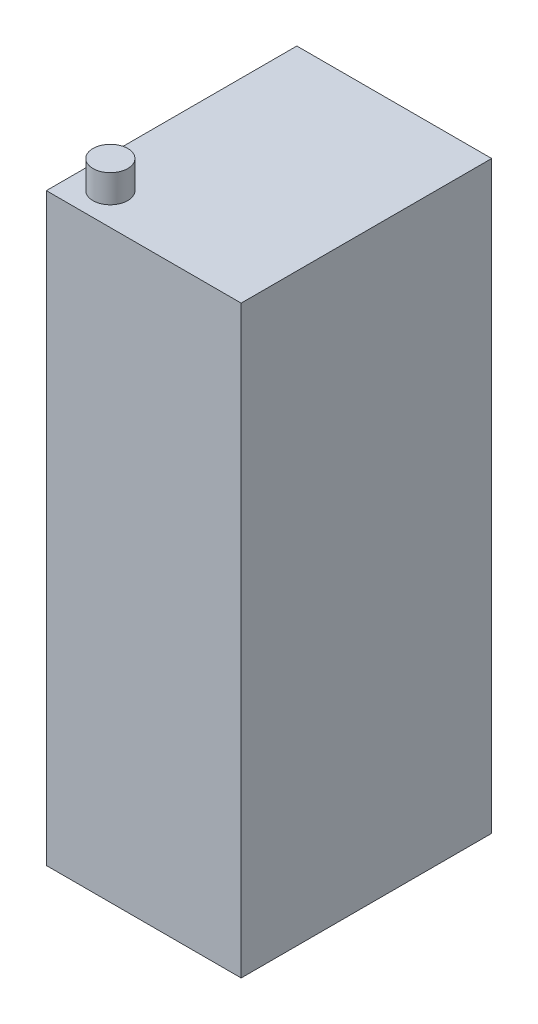
ISO-10303-21;
HEADER;
FILE_DESCRIPTION(('STEP AP214'),'2;1');
FILE_NAME('part.step','',(''),(''),'','','');
FILE_SCHEMA(('AUTOMOTIVE_DESIGN { 1 0 10303 214 1 1 1 1 }'));
ENDSEC;
DATA;
#1=APPLICATION_CONTEXT('core data for automotive mechanical design processes');
#2=APPLICATION_PROTOCOL_DEFINITION('international standard','automotive_design',2000,#1);
#3=PRODUCT_CONTEXT('',#1,'mechanical');
#4=PRODUCT('Part','Part','',(#3));
#5=PRODUCT_RELATED_PRODUCT_CATEGORY('part','',(#4));
#6=PRODUCT_DEFINITION_FORMATION('','',#4);
#7=PRODUCT_DEFINITION_CONTEXT('part definition',#1,'design');
#8=PRODUCT_DEFINITION('design','',#6,#7);
#9=PRODUCT_DEFINITION_SHAPE('','',#8);
#10=(LENGTH_UNIT() NAMED_UNIT(*) SI_UNIT(.MILLI.,.METRE.));
#11=(NAMED_UNIT(*) PLANE_ANGLE_UNIT() SI_UNIT($,.RADIAN.));
#12=(NAMED_UNIT(*) SI_UNIT($,.STERADIAN.) SOLID_ANGLE_UNIT());
#13=UNCERTAINTY_MEASURE_WITH_UNIT(LENGTH_MEASURE(1.E-05),#10,'distance_accuracy_value','');
#14=(GEOMETRIC_REPRESENTATION_CONTEXT(3) GLOBAL_UNCERTAINTY_ASSIGNED_CONTEXT((#13)) GLOBAL_UNIT_ASSIGNED_CONTEXT((#10,
#11,#12)) REPRESENTATION_CONTEXT('',''));
#15=CARTESIAN_POINT('',(0.,0.,0.));
#16=DIRECTION('',(0.,0.,1.));
#17=DIRECTION('',(1.,0.,0.));
#18=AXIS2_PLACEMENT_3D('',#15,#16,#17);
#19=CARTESIAN_POINT('',(-51.4577247646867,150.558894230769,90.));
#20=DIRECTION('',(-1.,0.,0.));
#21=DIRECTION('',(0.,-1.,0.));
#22=AXIS2_PLACEMENT_3D('',#19,#20,#21);
#23=PLANE('',#22);
#24=DIRECTION('',(0.,1.,0.));
#25=VECTOR('',#24,1.);
#26=CARTESIAN_POINT('',(-51.4577247646867,150.558894230769,0.));
#27=LINE('',#26,#25);
#28=CARTESIAN_POINT('',(-51.4577247646867,-59.4411057692308,0.));
#29=VERTEX_POINT('',#28);
#30=CARTESIAN_POINT('',(-51.4577247646867,150.558894230769,0.));
#31=VERTEX_POINT('',#30);
#32=EDGE_CURVE('E99',#29,#31,#27,.T.);
#33=ORIENTED_EDGE('',*,*,#32,.T.);
#34=DIRECTION('',(0.,0.,-1.));
#35=VECTOR('',#34,1.);
#36=CARTESIAN_POINT('',(-51.4577247646867,150.558894230769,90.));
#37=LINE('',#36,#35);
#38=CARTESIAN_POINT('',(-51.4577247646867,150.558894230769,90.));
#39=VERTEX_POINT('',#38);
#40=EDGE_CURVE('E41',#39,#31,#37,.T.);
#41=ORIENTED_EDGE('',*,*,#40,.F.);
#42=DIRECTION('',(0.,1.,0.));
#43=VECTOR('',#42,1.);
#44=CARTESIAN_POINT('',(-51.4577247646867,150.558894230769,90.));
#45=LINE('',#44,#43);
#46=CARTESIAN_POINT('',(-51.4577247646867,-59.4411057692308,90.));
#47=VERTEX_POINT('',#46);
#48=EDGE_CURVE('E85',#47,#39,#45,.T.);
#49=ORIENTED_EDGE('',*,*,#48,.F.);
#50=DIRECTION('',(0.,0.,-1.));
#51=VECTOR('',#50,1.);
#52=CARTESIAN_POINT('',(-51.4577247646867,-59.4411057692308,90.));
#53=LINE('',#52,#51);
#54=EDGE_CURVE('E95',#47,#29,#53,.T.);
#55=ORIENTED_EDGE('',*,*,#54,.T.);
#56=EDGE_LOOP('',(#33,#41,#49,#55));
#57=FACE_BOUND('',#56,.T.);
#58=ADVANCED_FACE('F33',(#57),#23,.F.);
#59=CARTESIAN_POINT('',(-121.457724764687,150.558894230769,90.));
#60=DIRECTION('',(0.,-1.,0.));
#61=DIRECTION('',(0.,0.,-1.));
#62=AXIS2_PLACEMENT_3D('',#59,#60,#61);
#63=PLANE('',#62);
#64=CARTESIAN_POINT('',(-109.957724764687,150.558894230769,78.5));
#65=DIRECTION('',(0.,-1.,0.));
#66=DIRECTION('',(0.,0.,-1.));
#67=AXIS2_PLACEMENT_3D('',#64,#65,#66);
#68=CIRCLE('',#67,6.25);
#69=CARTESIAN_POINT('',(-109.957724764687,150.558894230769,72.25));
#70=VERTEX_POINT('',#69);
#71=EDGE_CURVE('E11',#70,#70,#68,.F.);
#72=ORIENTED_EDGE('',*,*,#71,.F.);
#73=EDGE_LOOP('',(#72));
#74=FACE_BOUND('',#73,.T.);
#75=DIRECTION('',(-1.,0.,0.));
#76=VECTOR('',#75,1.);
#77=CARTESIAN_POINT('',(-121.457724764687,150.558894230769,0.));
#78=LINE('',#77,#76);
#79=CARTESIAN_POINT('',(-121.457724764687,150.558894230769,0.));
#80=VERTEX_POINT('',#79);
#81=EDGE_CURVE('E90',#31,#80,#78,.T.);
#82=ORIENTED_EDGE('',*,*,#81,.T.);
#83=DIRECTION('',(0.,0.,-1.));
#84=VECTOR('',#83,1.);
#85=CARTESIAN_POINT('',(-121.457724764687,150.558894230769,90.));
#86=LINE('',#85,#84);
#87=CARTESIAN_POINT('',(-121.457724764687,150.558894230769,90.));
#88=VERTEX_POINT('',#87);
#89=EDGE_CURVE('E88',#88,#80,#86,.T.);
#90=ORIENTED_EDGE('',*,*,#89,.F.);
#91=DIRECTION('',(-1.,0.,0.));
#92=VECTOR('',#91,1.);
#93=CARTESIAN_POINT('',(-121.457724764687,150.558894230769,90.));
#94=LINE('',#93,#92);
#95=EDGE_CURVE('E80',#39,#88,#94,.T.);
#96=ORIENTED_EDGE('',*,*,#95,.F.);
#97=ORIENTED_EDGE('',*,*,#40,.T.);
#98=EDGE_LOOP('',(#82,#90,#96,#97));
#99=FACE_BOUND('',#98,.T.);
#100=ADVANCED_FACE('F89',(#74,#99),#63,.F.);
#101=CARTESIAN_POINT('',(-121.457724764687,150.558894230769,90.));
#102=DIRECTION('',(1.,0.,0.));
#103=DIRECTION('',(0.,0.,-1.));
#104=AXIS2_PLACEMENT_3D('',#101,#102,#103);
#105=PLANE('',#104);
#106=DIRECTION('',(0.,-1.,0.));
#107=VECTOR('',#106,1.);
#108=CARTESIAN_POINT('',(-121.457724764687,150.558894230769,0.));
#109=LINE('',#108,#107);
#110=CARTESIAN_POINT('',(-121.457724764687,-59.4411057692308,0.));
#111=VERTEX_POINT('',#110);
#112=EDGE_CURVE('E66',#80,#111,#109,.T.);
#113=ORIENTED_EDGE('',*,*,#112,.T.);
#114=DIRECTION('',(0.,0.,-1.));
#115=VECTOR('',#114,1.);
#116=CARTESIAN_POINT('',(-121.457724764687,-59.4411057692308,90.));
#117=LINE('',#116,#115);
#118=CARTESIAN_POINT('',(-121.457724764687,-59.4411057692308,90.));
#119=VERTEX_POINT('',#118);
#120=EDGE_CURVE('E91',#119,#111,#117,.T.);
#121=ORIENTED_EDGE('',*,*,#120,.F.);
#122=DIRECTION('',(0.,-1.,0.));
#123=VECTOR('',#122,1.);
#124=CARTESIAN_POINT('',(-121.457724764687,150.558894230769,90.));
#125=LINE('',#124,#123);
#126=EDGE_CURVE('E83',#88,#119,#125,.T.);
#127=ORIENTED_EDGE('',*,*,#126,.F.);
#128=ORIENTED_EDGE('',*,*,#89,.T.);
#129=EDGE_LOOP('',(#113,#121,#127,#128));
#130=FACE_BOUND('',#129,.T.);
#131=ADVANCED_FACE('F93',(#130),#105,.F.);
#132=CARTESIAN_POINT('',(-121.457724764687,-59.4411057692308,90.));
#133=DIRECTION('',(0.,1.,0.));
#134=DIRECTION('',(-1.,0.,0.));
#135=AXIS2_PLACEMENT_3D('',#132,#133,#134);
#136=PLANE('',#135);
#137=DIRECTION('',(1.,0.,0.));
#138=VECTOR('',#137,1.);
#139=CARTESIAN_POINT('',(-121.457724764687,-59.4411057692308,0.));
#140=LINE('',#139,#138);
#141=EDGE_CURVE('E72',#111,#29,#140,.T.);
#142=ORIENTED_EDGE('',*,*,#141,.T.);
#143=ORIENTED_EDGE('',*,*,#54,.F.);
#144=DIRECTION('',(1.,0.,0.));
#145=VECTOR('',#144,1.);
#146=CARTESIAN_POINT('',(-121.457724764687,-59.4411057692308,90.));
#147=LINE('',#146,#145);
#148=EDGE_CURVE('E49',#119,#47,#147,.T.);
#149=ORIENTED_EDGE('',*,*,#148,.F.);
#150=ORIENTED_EDGE('',*,*,#120,.T.);
#151=EDGE_LOOP('',(#142,#143,#149,#150));
#152=FACE_BOUND('',#151,.T.);
#153=ADVANCED_FACE('F121',(#152),#136,.F.);
#154=CARTESIAN_POINT('',(0.,0.,90.));
#155=DIRECTION('',(0.,0.,1.));
#156=DIRECTION('',(1.,0.,0.));
#157=AXIS2_PLACEMENT_3D('',#154,#155,#156);
#158=PLANE('',#157);
#159=ORIENTED_EDGE('',*,*,#48,.T.);
#160=ORIENTED_EDGE('',*,*,#95,.T.);
#161=ORIENTED_EDGE('',*,*,#126,.T.);
#162=ORIENTED_EDGE('',*,*,#148,.T.);
#163=EDGE_LOOP('',(#159,#160,#161,#162));
#164=FACE_BOUND('',#163,.T.);
#165=ADVANCED_FACE('F81',(#164),#158,.T.);
#166=CARTESIAN_POINT('',(0.,0.,0.));
#167=DIRECTION('',(0.,0.,1.));
#168=DIRECTION('',(1.,0.,0.));
#169=AXIS2_PLACEMENT_3D('',#166,#167,#168);
#170=PLANE('',#169);
#171=ORIENTED_EDGE('',*,*,#32,.F.);
#172=ORIENTED_EDGE('',*,*,#141,.F.);
#173=ORIENTED_EDGE('',*,*,#112,.F.);
#174=ORIENTED_EDGE('',*,*,#81,.F.);
#175=EDGE_LOOP('',(#171,#172,#173,#174));
#176=FACE_BOUND('',#175,.T.);
#177=ADVANCED_FACE('F110',(#176),#170,.F.);
#178=CARTESIAN_POINT('',(-109.957724764687,160.558894230769,78.5));
#179=DIRECTION('',(0.,-1.,0.));
#180=DIRECTION('',(0.,0.,-1.));
#181=AXIS2_PLACEMENT_3D('',#178,#179,#180);
#182=CYLINDRICAL_SURFACE('',#181,6.25);
#183=CARTESIAN_POINT('',(-109.957724764687,160.558894230769,78.5));
#184=DIRECTION('',(0.,1.,0.));
#185=DIRECTION('',(0.,0.,1.));
#186=AXIS2_PLACEMENT_3D('',#183,#184,#185);
#187=CIRCLE('',#186,6.25);
#188=CARTESIAN_POINT('',(-109.957724764687,160.558894230769,84.75));
#189=VERTEX_POINT('',#188);
#190=EDGE_CURVE('E102',#189,#189,#187,.T.);
#191=ORIENTED_EDGE('',*,*,#190,.F.);
#192=EDGE_LOOP('',(#191));
#193=FACE_BOUND('',#192,.T.);
#194=ORIENTED_EDGE('',*,*,#71,.T.);
#195=EDGE_LOOP('',(#194));
#196=FACE_BOUND('',#195,.T.);
#197=ADVANCED_FACE('F112',(#193,#196),#182,.T.);
#198=CARTESIAN_POINT('',(-109.957724764687,160.558894230769,78.5));
#199=DIRECTION('',(0.,1.,0.));
#200=DIRECTION('',(0.,0.,1.));
#201=AXIS2_PLACEMENT_3D('',#198,#199,#200);
#202=PLANE('',#201);
#203=ORIENTED_EDGE('',*,*,#190,.T.);
#204=EDGE_LOOP('',(#203));
#205=FACE_BOUND('',#204,.T.);
#206=ADVANCED_FACE('F118',(#205),#202,.T.);
#207=CLOSED_SHELL('',(#58,#100,#131,#153,#165,#177,#197,#206));
#208=MANIFOLD_SOLID_BREP('B2',#207);
#209=ADVANCED_BREP_SHAPE_REPRESENTATION('',(#18,#208),#14);
#210=SHAPE_DEFINITION_REPRESENTATION(#9,#209);
ENDSEC;
END-ISO-10303-21;
